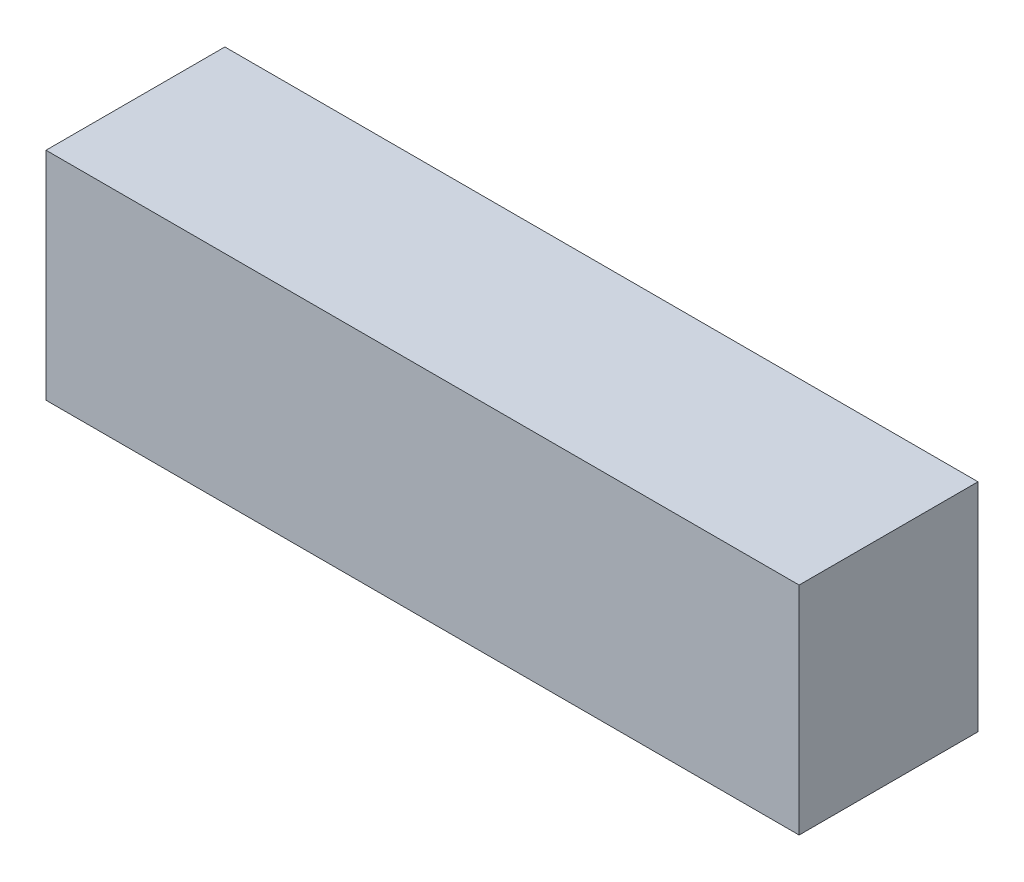
ISO-10303-21;
HEADER;
FILE_DESCRIPTION(('STEP AP214'),'2;1');
FILE_NAME('part.step','',(''),(''),'','','');
FILE_SCHEMA(('AUTOMOTIVE_DESIGN { 1 0 10303 214 1 1 1 1 }'));
ENDSEC;
DATA;
#1=APPLICATION_CONTEXT('core data for automotive mechanical design processes');
#2=APPLICATION_PROTOCOL_DEFINITION('international standard','automotive_design',2000,#1);
#3=PRODUCT_CONTEXT('',#1,'mechanical');
#4=PRODUCT('Part','Part','',(#3));
#5=PRODUCT_RELATED_PRODUCT_CATEGORY('part','',(#4));
#6=PRODUCT_DEFINITION_FORMATION('','',#4);
#7=PRODUCT_DEFINITION_CONTEXT('part definition',#1,'design');
#8=PRODUCT_DEFINITION('design','',#6,#7);
#9=PRODUCT_DEFINITION_SHAPE('','',#8);
#10=(LENGTH_UNIT() NAMED_UNIT(*) SI_UNIT(.MILLI.,.METRE.));
#11=(NAMED_UNIT(*) PLANE_ANGLE_UNIT() SI_UNIT($,.RADIAN.));
#12=(NAMED_UNIT(*) SI_UNIT($,.STERADIAN.) SOLID_ANGLE_UNIT());
#13=UNCERTAINTY_MEASURE_WITH_UNIT(LENGTH_MEASURE(1.E-05),#10,'distance_accuracy_value','');
#14=(GEOMETRIC_REPRESENTATION_CONTEXT(3) GLOBAL_UNCERTAINTY_ASSIGNED_CONTEXT((#13)) GLOBAL_UNIT_ASSIGNED_CONTEXT((#10,
#11,#12)) REPRESENTATION_CONTEXT('',''));
#15=CARTESIAN_POINT('',(0.,0.,0.));
#16=DIRECTION('',(0.,0.,1.));
#17=DIRECTION('',(1.,0.,0.));
#18=AXIS2_PLACEMENT_3D('',#15,#16,#17);
#19=CARTESIAN_POINT('',(0.,0.,9.5));
#20=DIRECTION('',(1.,0.,0.));
#21=DIRECTION('',(0.,0.,-1.));
#22=AXIS2_PLACEMENT_3D('',#19,#20,#21);
#23=PLANE('',#22);
#24=DIRECTION('',(0.,-1.,0.));
#25=VECTOR('',#24,1.);
#26=CARTESIAN_POINT('',(0.,0.,0.));
#27=LINE('',#26,#25);
#28=CARTESIAN_POINT('',(0.,11.5,0.));
#29=VERTEX_POINT('',#28);
#30=CARTESIAN_POINT('',(0.,0.,0.));
#31=VERTEX_POINT('',#30);
#32=EDGE_CURVE('E96',#29,#31,#27,.T.);
#33=ORIENTED_EDGE('',*,*,#32,.T.);
#34=DIRECTION('',(0.,0.,-1.));
#35=VECTOR('',#34,1.);
#36=CARTESIAN_POINT('',(0.,0.,9.5));
#37=LINE('',#36,#35);
#38=CARTESIAN_POINT('',(0.,0.,9.5));
#39=VERTEX_POINT('',#38);
#40=EDGE_CURVE('E11',#39,#31,#37,.T.);
#41=ORIENTED_EDGE('',*,*,#40,.F.);
#42=DIRECTION('',(0.,-1.,0.));
#43=VECTOR('',#42,1.);
#44=CARTESIAN_POINT('',(0.,0.,9.5));
#45=LINE('',#44,#43);
#46=CARTESIAN_POINT('',(0.,11.5,9.5));
#47=VERTEX_POINT('',#46);
#48=EDGE_CURVE('E84',#47,#39,#45,.T.);
#49=ORIENTED_EDGE('',*,*,#48,.F.);
#50=DIRECTION('',(0.,0.,-1.));
#51=VECTOR('',#50,1.);
#52=CARTESIAN_POINT('',(0.,11.5,9.5));
#53=LINE('',#52,#51);
#54=EDGE_CURVE('E92',#47,#29,#53,.T.);
#55=ORIENTED_EDGE('',*,*,#54,.T.);
#56=EDGE_LOOP('',(#33,#41,#49,#55));
#57=FACE_BOUND('',#56,.T.);
#58=ADVANCED_FACE('F33',(#57),#23,.F.);
#59=CARTESIAN_POINT('',(0.,0.,9.5));
#60=DIRECTION('',(0.,1.,0.));
#61=DIRECTION('',(0.,0.,1.));
#62=AXIS2_PLACEMENT_3D('',#59,#60,#61);
#63=PLANE('',#62);
#64=DIRECTION('',(1.,0.,0.));
#65=VECTOR('',#64,1.);
#66=CARTESIAN_POINT('',(0.,0.,0.));
#67=LINE('',#66,#65);
#68=CARTESIAN_POINT('',(40.,0.,0.));
#69=VERTEX_POINT('',#68);
#70=EDGE_CURVE('E88',#31,#69,#67,.T.);
#71=ORIENTED_EDGE('',*,*,#70,.T.);
#72=DIRECTION('',(0.,0.,-1.));
#73=VECTOR('',#72,1.);
#74=CARTESIAN_POINT('',(40.,0.,9.5));
#75=LINE('',#74,#73);
#76=CARTESIAN_POINT('',(40.,0.,9.5));
#77=VERTEX_POINT('',#76);
#78=EDGE_CURVE('E41',#77,#69,#75,.T.);
#79=ORIENTED_EDGE('',*,*,#78,.F.);
#80=DIRECTION('',(1.,0.,0.));
#81=VECTOR('',#80,1.);
#82=CARTESIAN_POINT('',(0.,0.,9.5));
#83=LINE('',#82,#81);
#84=EDGE_CURVE('E79',#39,#77,#83,.T.);
#85=ORIENTED_EDGE('',*,*,#84,.F.);
#86=ORIENTED_EDGE('',*,*,#40,.T.);
#87=EDGE_LOOP('',(#71,#79,#85,#86));
#88=FACE_BOUND('',#87,.T.);
#89=ADVANCED_FACE('F87',(#88),#63,.F.);
#90=CARTESIAN_POINT('',(40.,0.,9.5));
#91=DIRECTION('',(-1.,0.,0.));
#92=DIRECTION('',(0.,-1.,0.));
#93=AXIS2_PLACEMENT_3D('',#90,#91,#92);
#94=PLANE('',#93);
#95=DIRECTION('',(0.,1.,0.));
#96=VECTOR('',#95,1.);
#97=CARTESIAN_POINT('',(40.,0.,0.));
#98=LINE('',#97,#96);
#99=CARTESIAN_POINT('',(40.,11.5,0.));
#100=VERTEX_POINT('',#99);
#101=EDGE_CURVE('E66',#69,#100,#98,.T.);
#102=ORIENTED_EDGE('',*,*,#101,.T.);
#103=DIRECTION('',(0.,0.,-1.));
#104=VECTOR('',#103,1.);
#105=CARTESIAN_POINT('',(40.,11.5,9.5));
#106=LINE('',#105,#104);
#107=CARTESIAN_POINT('',(40.,11.5,9.5));
#108=VERTEX_POINT('',#107);
#109=EDGE_CURVE('E89',#108,#100,#106,.T.);
#110=ORIENTED_EDGE('',*,*,#109,.F.);
#111=DIRECTION('',(0.,1.,0.));
#112=VECTOR('',#111,1.);
#113=CARTESIAN_POINT('',(40.,0.,9.5));
#114=LINE('',#113,#112);
#115=EDGE_CURVE('E82',#77,#108,#114,.T.);
#116=ORIENTED_EDGE('',*,*,#115,.F.);
#117=ORIENTED_EDGE('',*,*,#78,.T.);
#118=EDGE_LOOP('',(#102,#110,#116,#117));
#119=FACE_BOUND('',#118,.T.);
#120=ADVANCED_FACE('F90',(#119),#94,.F.);
#121=CARTESIAN_POINT('',(0.,11.5,9.5));
#122=DIRECTION('',(0.,-1.,0.));
#123=DIRECTION('',(0.,0.,-1.));
#124=AXIS2_PLACEMENT_3D('',#121,#122,#123);
#125=PLANE('',#124);
#126=DIRECTION('',(-1.,0.,0.));
#127=VECTOR('',#126,1.);
#128=CARTESIAN_POINT('',(0.,11.5,0.));
#129=LINE('',#128,#127);
#130=EDGE_CURVE('E72',#100,#29,#129,.T.);
#131=ORIENTED_EDGE('',*,*,#130,.T.);
#132=ORIENTED_EDGE('',*,*,#54,.F.);
#133=DIRECTION('',(-1.,0.,0.));
#134=VECTOR('',#133,1.);
#135=CARTESIAN_POINT('',(0.,11.5,9.5));
#136=LINE('',#135,#134);
#137=EDGE_CURVE('E49',#108,#47,#136,.T.);
#138=ORIENTED_EDGE('',*,*,#137,.F.);
#139=ORIENTED_EDGE('',*,*,#109,.T.);
#140=EDGE_LOOP('',(#131,#132,#138,#139));
#141=FACE_BOUND('',#140,.T.);
#142=ADVANCED_FACE('F103',(#141),#125,.F.);
#143=CARTESIAN_POINT('',(0.,0.,9.5));
#144=DIRECTION('',(0.,0.,-1.));
#145=DIRECTION('',(-1.,0.,0.));
#146=AXIS2_PLACEMENT_3D('',#143,#144,#145);
#147=PLANE('',#146);
#148=ORIENTED_EDGE('',*,*,#48,.T.);
#149=ORIENTED_EDGE('',*,*,#84,.T.);
#150=ORIENTED_EDGE('',*,*,#115,.T.);
#151=ORIENTED_EDGE('',*,*,#137,.T.);
#152=EDGE_LOOP('',(#148,#149,#150,#151));
#153=FACE_BOUND('',#152,.T.);
#154=ADVANCED_FACE('F80',(#153),#147,.F.);
#155=CARTESIAN_POINT('',(0.,0.,0.));
#156=DIRECTION('',(0.,0.,-1.));
#157=DIRECTION('',(-1.,0.,0.));
#158=AXIS2_PLACEMENT_3D('',#155,#156,#157);
#159=PLANE('',#158);
#160=ORIENTED_EDGE('',*,*,#32,.F.);
#161=ORIENTED_EDGE('',*,*,#130,.F.);
#162=ORIENTED_EDGE('',*,*,#101,.F.);
#163=ORIENTED_EDGE('',*,*,#70,.F.);
#164=EDGE_LOOP('',(#160,#161,#162,#163));
#165=FACE_BOUND('',#164,.T.);
#166=ADVANCED_FACE('F106',(#165),#159,.T.);
#167=CLOSED_SHELL('',(#58,#89,#120,#142,#154,#166));
#168=MANIFOLD_SOLID_BREP('B2',#167);
#169=ADVANCED_BREP_SHAPE_REPRESENTATION('',(#18,#168),#14);
#170=SHAPE_DEFINITION_REPRESENTATION(#9,#169);
ENDSEC;
END-ISO-10303-21;
